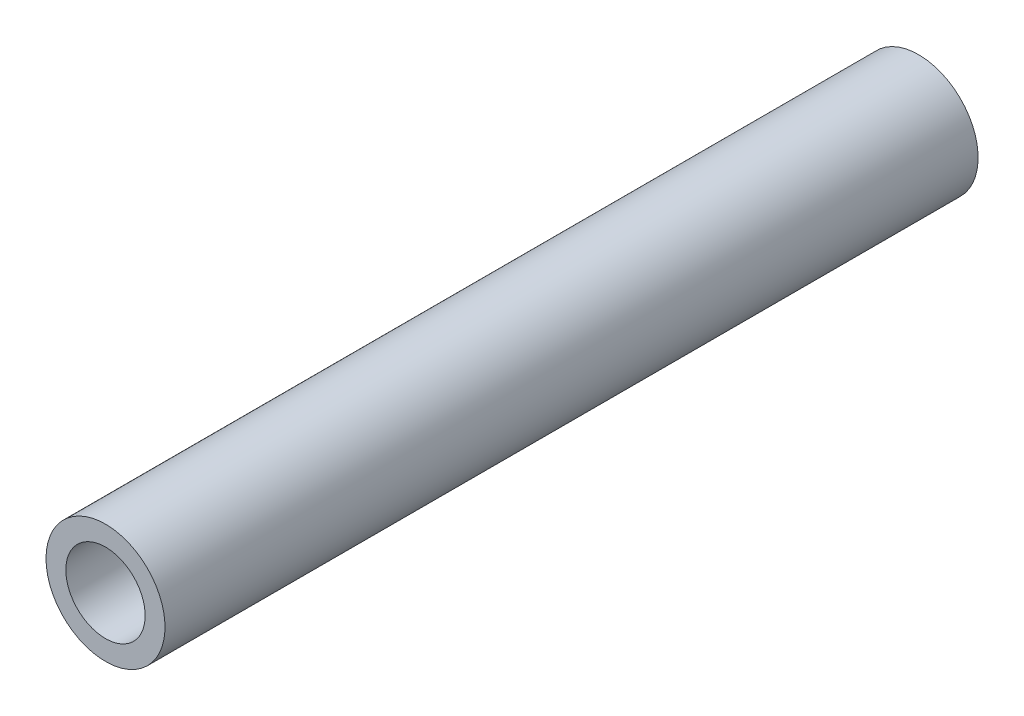
ISO-10303-21;
HEADER;
FILE_DESCRIPTION(('STEP AP214'),'2;1');
FILE_NAME('part.step','',(''),(''),'','','');
FILE_SCHEMA(('AUTOMOTIVE_DESIGN { 1 0 10303 214 1 1 1 1 }'));
ENDSEC;
DATA;
#1=APPLICATION_CONTEXT('core data for automotive mechanical design processes');
#2=APPLICATION_PROTOCOL_DEFINITION('international standard','automotive_design',2000,#1);
#3=PRODUCT_CONTEXT('',#1,'mechanical');
#4=PRODUCT('Part','Part','',(#3));
#5=PRODUCT_RELATED_PRODUCT_CATEGORY('part','',(#4));
#6=PRODUCT_DEFINITION_FORMATION('','',#4);
#7=PRODUCT_DEFINITION_CONTEXT('part definition',#1,'design');
#8=PRODUCT_DEFINITION('design','',#6,#7);
#9=PRODUCT_DEFINITION_SHAPE('','',#8);
#10=(LENGTH_UNIT() NAMED_UNIT(*) SI_UNIT(.MILLI.,.METRE.));
#11=(NAMED_UNIT(*) PLANE_ANGLE_UNIT() SI_UNIT($,.RADIAN.));
#12=(NAMED_UNIT(*) SI_UNIT($,.STERADIAN.) SOLID_ANGLE_UNIT());
#13=UNCERTAINTY_MEASURE_WITH_UNIT(LENGTH_MEASURE(1.E-05),#10,'distance_accuracy_value','');
#14=(GEOMETRIC_REPRESENTATION_CONTEXT(3) GLOBAL_UNCERTAINTY_ASSIGNED_CONTEXT((#13)) GLOBAL_UNIT_ASSIGNED_CONTEXT((#10,
#11,#12)) REPRESENTATION_CONTEXT('',''));
#15=CARTESIAN_POINT('',(0.,0.,0.));
#16=DIRECTION('',(0.,0.,1.));
#17=DIRECTION('',(1.,0.,0.));
#18=AXIS2_PLACEMENT_3D('',#15,#16,#17);
#19=CARTESIAN_POINT('',(0.,0.,41.));
#20=DIRECTION('',(0.,0.,-1.));
#21=DIRECTION('',(-1.,0.,0.));
#22=AXIS2_PLACEMENT_3D('',#19,#20,#21);
#23=CYLINDRICAL_SURFACE('',#22,2.);
#24=CARTESIAN_POINT('',(0.,0.,0.));
#25=DIRECTION('',(0.,0.,-1.));
#26=DIRECTION('',(-1.,0.,0.));
#27=AXIS2_PLACEMENT_3D('',#24,#25,#26);
#28=CIRCLE('',#27,2.);
#29=CARTESIAN_POINT('',(-2.,0.,0.));
#30=VERTEX_POINT('',#29);
#31=EDGE_CURVE('E27',#30,#30,#28,.T.);
#32=ORIENTED_EDGE('',*,*,#31,.T.);
#33=EDGE_LOOP('',(#32));
#34=FACE_BOUND('',#33,.T.);
#35=CARTESIAN_POINT('',(0.,0.,41.));
#36=DIRECTION('',(0.,0.,-1.));
#37=DIRECTION('',(-1.,0.,0.));
#38=AXIS2_PLACEMENT_3D('',#35,#36,#37);
#39=CIRCLE('',#38,2.);
#40=CARTESIAN_POINT('',(-2.,0.,41.));
#41=VERTEX_POINT('',#40);
#42=EDGE_CURVE('E18',#41,#41,#39,.T.);
#43=ORIENTED_EDGE('',*,*,#42,.F.);
#44=EDGE_LOOP('',(#43));
#45=FACE_BOUND('',#44,.T.);
#46=ADVANCED_FACE('F15',(#34,#45),#23,.F.);
#47=CARTESIAN_POINT('',(0.,0.,41.));
#48=DIRECTION('',(0.,0.,1.));
#49=DIRECTION('',(1.,0.,0.));
#50=AXIS2_PLACEMENT_3D('',#47,#48,#49);
#51=PLANE('',#50);
#52=ORIENTED_EDGE('',*,*,#42,.T.);
#53=EDGE_LOOP('',(#52));
#54=FACE_BOUND('',#53,.T.);
#55=CARTESIAN_POINT('',(0.,0.,41.));
#56=DIRECTION('',(0.,0.,-1.));
#57=DIRECTION('',(-1.,0.,0.));
#58=AXIS2_PLACEMENT_3D('',#55,#56,#57);
#59=CIRCLE('',#58,3.);
#60=CARTESIAN_POINT('',(-3.,0.,41.));
#61=VERTEX_POINT('',#60);
#62=EDGE_CURVE('E22',#61,#61,#59,.T.);
#63=ORIENTED_EDGE('',*,*,#62,.F.);
#64=EDGE_LOOP('',(#63));
#65=FACE_BOUND('',#64,.T.);
#66=ADVANCED_FACE('F35',(#54,#65),#51,.T.);
#67=CARTESIAN_POINT('',(0.,0.,0.));
#68=DIRECTION('',(0.,0.,1.));
#69=DIRECTION('',(1.,0.,0.));
#70=AXIS2_PLACEMENT_3D('',#67,#68,#69);
#71=PLANE('',#70);
#72=ORIENTED_EDGE('',*,*,#31,.F.);
#73=EDGE_LOOP('',(#72));
#74=FACE_BOUND('',#73,.T.);
#75=CARTESIAN_POINT('',(0.,0.,0.));
#76=DIRECTION('',(0.,0.,-1.));
#77=DIRECTION('',(-1.,0.,0.));
#78=AXIS2_PLACEMENT_3D('',#75,#76,#77);
#79=CIRCLE('',#78,3.);
#80=CARTESIAN_POINT('',(-3.,0.,0.));
#81=VERTEX_POINT('',#80);
#82=EDGE_CURVE('E10',#81,#81,#79,.F.);
#83=ORIENTED_EDGE('',*,*,#82,.F.);
#84=EDGE_LOOP('',(#83));
#85=FACE_BOUND('',#84,.T.);
#86=ADVANCED_FACE('F43',(#74,#85),#71,.F.);
#87=CARTESIAN_POINT('',(0.,0.,41.));
#88=DIRECTION('',(0.,0.,-1.));
#89=DIRECTION('',(-1.,0.,0.));
#90=AXIS2_PLACEMENT_3D('',#87,#88,#89);
#91=CYLINDRICAL_SURFACE('',#90,3.);
#92=ORIENTED_EDGE('',*,*,#82,.T.);
#93=EDGE_LOOP('',(#92));
#94=FACE_BOUND('',#93,.T.);
#95=ORIENTED_EDGE('',*,*,#62,.T.);
#96=EDGE_LOOP('',(#95));
#97=FACE_BOUND('',#96,.T.);
#98=ADVANCED_FACE('F44',(#94,#97),#91,.T.);
#99=CLOSED_SHELL('',(#46,#66,#86,#98));
#100=MANIFOLD_SOLID_BREP('B1',#99);
#101=ADVANCED_BREP_SHAPE_REPRESENTATION('',(#18,#100),#14);
#102=SHAPE_DEFINITION_REPRESENTATION(#9,#101);
ENDSEC;
END-ISO-10303-21;
